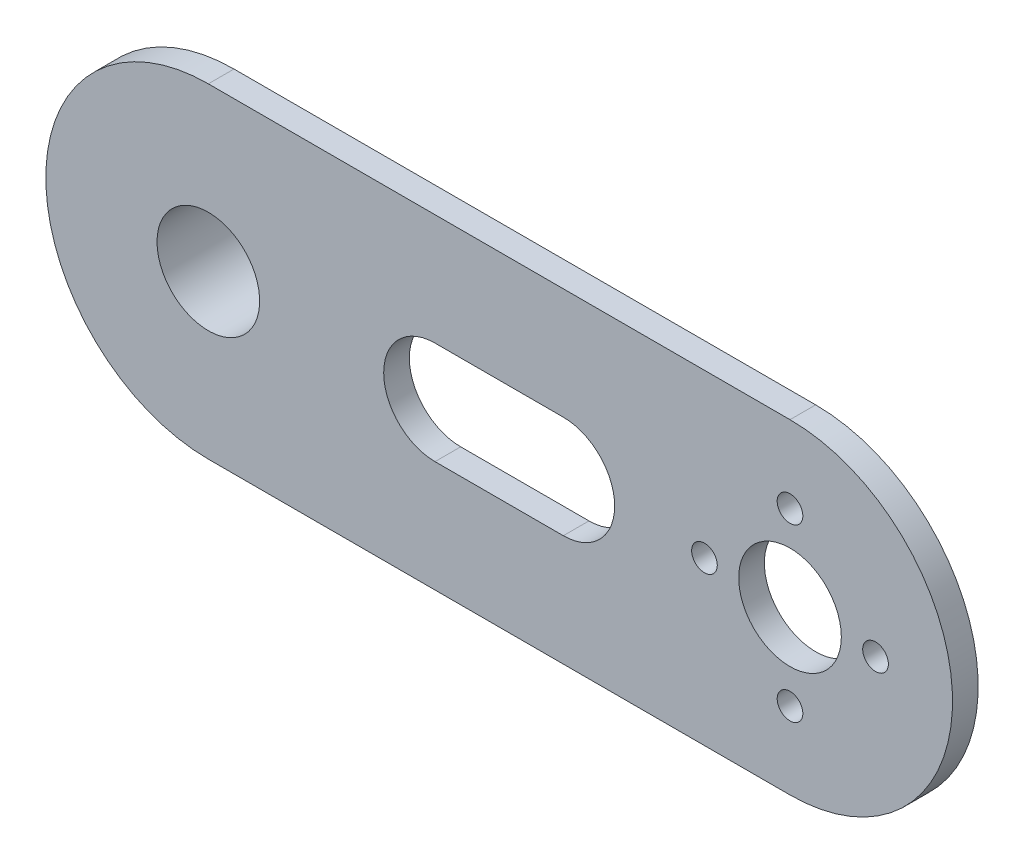
ISO-10303-21;
HEADER;
FILE_DESCRIPTION(('STEP AP214'),'2;1');
FILE_NAME('part.step','',(''),(''),'','','');
FILE_SCHEMA(('AUTOMOTIVE_DESIGN { 1 0 10303 214 1 1 1 1 }'));
ENDSEC;
DATA;
#1=APPLICATION_CONTEXT('core data for automotive mechanical design processes');
#2=APPLICATION_PROTOCOL_DEFINITION('international standard','automotive_design',2000,#1);
#3=PRODUCT_CONTEXT('',#1,'mechanical');
#4=PRODUCT('Part','Part','',(#3));
#5=PRODUCT_RELATED_PRODUCT_CATEGORY('part','',(#4));
#6=PRODUCT_DEFINITION_FORMATION('','',#4);
#7=PRODUCT_DEFINITION_CONTEXT('part definition',#1,'design');
#8=PRODUCT_DEFINITION('design','',#6,#7);
#9=PRODUCT_DEFINITION_SHAPE('','',#8);
#10=(LENGTH_UNIT() NAMED_UNIT(*) SI_UNIT(.MILLI.,.METRE.));
#11=(NAMED_UNIT(*) PLANE_ANGLE_UNIT() SI_UNIT($,.RADIAN.));
#12=(NAMED_UNIT(*) SI_UNIT($,.STERADIAN.) SOLID_ANGLE_UNIT());
#13=UNCERTAINTY_MEASURE_WITH_UNIT(LENGTH_MEASURE(1.E-05),#10,'distance_accuracy_value','');
#14=(GEOMETRIC_REPRESENTATION_CONTEXT(3) GLOBAL_UNCERTAINTY_ASSIGNED_CONTEXT((#13)) GLOBAL_UNIT_ASSIGNED_CONTEXT((#10,
#11,#12)) REPRESENTATION_CONTEXT('',''));
#15=CARTESIAN_POINT('',(0.,0.,0.));
#16=DIRECTION('',(0.,0.,1.));
#17=DIRECTION('',(1.,0.,0.));
#18=AXIS2_PLACEMENT_3D('',#15,#16,#17);
#19=CARTESIAN_POINT('',(0.,0.,9.));
#20=DIRECTION('',(0.,0.,-1.));
#21=DIRECTION('',(-1.,0.,0.));
#22=AXIS2_PLACEMENT_3D('',#19,#20,#21);
#23=CYLINDRICAL_SURFACE('',#22,19.);
#24=DIRECTION('',(0.,0.,1.));
#25=VECTOR('',#24,1.);
#26=CARTESIAN_POINT('',(0.,-19.,6.));
#27=LINE('',#26,#25);
#28=CARTESIAN_POINT('',(0.,-19.,6.));
#29=VERTEX_POINT('',#28);
#30=CARTESIAN_POINT('',(0.,-19.,9.));
#31=VERTEX_POINT('',#30);
#32=EDGE_CURVE('E202',#29,#31,#27,.T.);
#33=ORIENTED_EDGE('',*,*,#32,.T.);
#34=CARTESIAN_POINT('',(0.,0.,9.));
#35=DIRECTION('',(0.,0.,1.));
#36=DIRECTION('',(1.,0.,0.));
#37=AXIS2_PLACEMENT_3D('',#34,#35,#36);
#38=CIRCLE('',#37,19.);
#39=CARTESIAN_POINT('',(0.,19.,9.));
#40=VERTEX_POINT('',#39);
#41=EDGE_CURVE('E223',#40,#31,#38,.T.);
#42=ORIENTED_EDGE('',*,*,#41,.F.);
#43=DIRECTION('',(0.,0.,1.));
#44=VECTOR('',#43,1.);
#45=CARTESIAN_POINT('',(0.,19.,6.));
#46=LINE('',#45,#44);
#47=CARTESIAN_POINT('',(0.,19.,6.));
#48=VERTEX_POINT('',#47);
#49=EDGE_CURVE('E206',#48,#40,#46,.T.);
#50=ORIENTED_EDGE('',*,*,#49,.F.);
#51=CARTESIAN_POINT('',(0.,0.,6.));
#52=DIRECTION('',(0.,0.,1.));
#53=DIRECTION('',(1.,0.,0.));
#54=AXIS2_PLACEMENT_3D('',#51,#52,#53);
#55=CIRCLE('',#54,19.);
#56=EDGE_CURVE('E219',#48,#29,#55,.T.);
#57=ORIENTED_EDGE('',*,*,#56,.T.);
#58=EDGE_LOOP('',(#33,#42,#50,#57));
#59=FACE_BOUND('',#58,.T.);
#60=ADVANCED_FACE('F44',(#59),#23,.T.);
#61=CARTESIAN_POINT('',(0.,0.,4.));
#62=DIRECTION('',(0.,0.,-1.));
#63=DIRECTION('',(-1.,0.,0.));
#64=AXIS2_PLACEMENT_3D('',#61,#62,#63);
#65=CYLINDRICAL_SURFACE('',#64,9.985);
#66=CARTESIAN_POINT('',(0.,0.,4.));
#67=DIRECTION('',(0.,0.,1.));
#68=DIRECTION('',(1.,0.,0.));
#69=AXIS2_PLACEMENT_3D('',#66,#67,#68);
#70=CIRCLE('',#69,9.985);
#71=CARTESIAN_POINT('',(9.985,0.,4.));
#72=VERTEX_POINT('',#71);
#73=EDGE_CURVE('E238',#72,#72,#70,.T.);
#74=ORIENTED_EDGE('',*,*,#73,.F.);
#75=EDGE_LOOP('',(#74));
#76=FACE_BOUND('',#75,.T.);
#77=CARTESIAN_POINT('',(0.,0.,0.));
#78=DIRECTION('',(0.,0.,1.));
#79=DIRECTION('',(1.,0.,0.));
#80=AXIS2_PLACEMENT_3D('',#77,#78,#79);
#81=CIRCLE('',#80,9.985);
#82=CARTESIAN_POINT('',(9.985,0.,0.));
#83=VERTEX_POINT('',#82);
#84=EDGE_CURVE('E234',#83,#83,#81,.T.);
#85=ORIENTED_EDGE('',*,*,#84,.T.);
#86=EDGE_LOOP('',(#85));
#87=FACE_BOUND('',#86,.T.);
#88=ADVANCED_FACE('F46',(#76,#87),#65,.T.);
#89=CARTESIAN_POINT('',(0.,0.,0.));
#90=DIRECTION('',(0.,0.,1.));
#91=DIRECTION('',(1.,0.,0.));
#92=AXIS2_PLACEMENT_3D('',#89,#90,#91);
#93=PLANE('',#92);
#94=CARTESIAN_POINT('',(0.,0.,0.));
#95=DIRECTION('',(0.,0.,-1.));
#96=DIRECTION('',(-1.,0.,0.));
#97=AXIS2_PLACEMENT_3D('',#94,#95,#96);
#98=CIRCLE('',#97,6.);
#99=CARTESIAN_POINT('',(-6.,0.,0.));
#100=VERTEX_POINT('',#99);
#101=EDGE_CURVE('E205',#100,#100,#98,.T.);
#102=ORIENTED_EDGE('',*,*,#101,.F.);
#103=EDGE_LOOP('',(#102));
#104=FACE_BOUND('',#103,.T.);
#105=ORIENTED_EDGE('',*,*,#84,.F.);
#106=EDGE_LOOP('',(#105));
#107=FACE_BOUND('',#106,.T.);
#108=ADVANCED_FACE('F279',(#104,#107),#93,.F.);
#109=CARTESIAN_POINT('',(0.,0.,6.));
#110=DIRECTION('',(0.,0.,-1.));
#111=DIRECTION('',(-1.,0.,0.));
#112=AXIS2_PLACEMENT_3D('',#109,#110,#111);
#113=CYLINDRICAL_SURFACE('',#112,11.5);
#114=CARTESIAN_POINT('',(0.,0.,6.));
#115=DIRECTION('',(0.,0.,1.));
#116=DIRECTION('',(1.,0.,0.));
#117=AXIS2_PLACEMENT_3D('',#114,#115,#116);
#118=CIRCLE('',#117,11.5);
#119=CARTESIAN_POINT('',(11.5,0.,6.));
#120=VERTEX_POINT('',#119);
#121=EDGE_CURVE('E230',#120,#120,#118,.T.);
#122=ORIENTED_EDGE('',*,*,#121,.F.);
#123=EDGE_LOOP('',(#122));
#124=FACE_BOUND('',#123,.T.);
#125=CARTESIAN_POINT('',(0.,0.,4.));
#126=DIRECTION('',(0.,0.,1.));
#127=DIRECTION('',(1.,0.,0.));
#128=AXIS2_PLACEMENT_3D('',#125,#126,#127);
#129=CIRCLE('',#128,11.5);
#130=CARTESIAN_POINT('',(11.5,0.,4.));
#131=VERTEX_POINT('',#130);
#132=EDGE_CURVE('E227',#131,#131,#129,.T.);
#133=ORIENTED_EDGE('',*,*,#132,.T.);
#134=EDGE_LOOP('',(#133));
#135=FACE_BOUND('',#134,.T.);
#136=ADVANCED_FACE('F287',(#124,#135),#113,.T.);
#137=CARTESIAN_POINT('',(0.,0.,4.));
#138=DIRECTION('',(0.,0.,1.));
#139=DIRECTION('',(1.,0.,0.));
#140=AXIS2_PLACEMENT_3D('',#137,#138,#139);
#141=PLANE('',#140);
#142=ORIENTED_EDGE('',*,*,#73,.T.);
#143=EDGE_LOOP('',(#142));
#144=FACE_BOUND('',#143,.T.);
#145=ORIENTED_EDGE('',*,*,#132,.F.);
#146=EDGE_LOOP('',(#145));
#147=FACE_BOUND('',#146,.T.);
#148=ADVANCED_FACE('F284',(#144,#147),#141,.F.);
#149=CARTESIAN_POINT('',(0.,0.,9.));
#150=DIRECTION('',(0.,0.,1.));
#151=DIRECTION('',(1.,0.,0.));
#152=AXIS2_PLACEMENT_3D('',#149,#150,#151);
#153=PLANE('',#152);
#154=CARTESIAN_POINT('',(26.5,0.,9.));
#155=DIRECTION('',(0.,0.,1.));
#156=DIRECTION('',(1.,0.,0.));
#157=AXIS2_PLACEMENT_3D('',#154,#155,#156);
#158=CIRCLE('',#157,6.);
#159=CARTESIAN_POINT('',(26.5,6.,9.));
#160=VERTEX_POINT('',#159);
#161=CARTESIAN_POINT('',(26.5,-6.,9.));
#162=VERTEX_POINT('',#161);
#163=EDGE_CURVE('E60',#160,#162,#158,.T.);
#164=ORIENTED_EDGE('',*,*,#163,.F.);
#165=DIRECTION('',(-1.,0.,0.));
#166=VECTOR('',#165,1.);
#167=CARTESIAN_POINT('',(26.5,6.,9.));
#168=LINE('',#167,#166);
#169=CARTESIAN_POINT('',(41.5,6.,9.));
#170=VERTEX_POINT('',#169);
#171=EDGE_CURVE('E118',#170,#160,#168,.T.);
#172=ORIENTED_EDGE('',*,*,#171,.F.);
#173=CARTESIAN_POINT('',(41.5,0.,9.));
#174=DIRECTION('',(0.,0.,1.));
#175=DIRECTION('',(1.,0.,0.));
#176=AXIS2_PLACEMENT_3D('',#173,#174,#175);
#177=CIRCLE('',#176,6.);
#178=CARTESIAN_POINT('',(41.5,-6.,9.));
#179=VERTEX_POINT('',#178);
#180=EDGE_CURVE('E125',#179,#170,#177,.T.);
#181=ORIENTED_EDGE('',*,*,#180,.F.);
#182=DIRECTION('',(1.,0.,0.));
#183=VECTOR('',#182,1.);
#184=CARTESIAN_POINT('',(26.5,-6.,9.));
#185=LINE('',#184,#183);
#186=EDGE_CURVE('E131',#162,#179,#185,.T.);
#187=ORIENTED_EDGE('',*,*,#186,.F.);
#188=EDGE_LOOP('',(#164,#172,#181,#187));
#189=FACE_BOUND('',#188,.T.);
#190=CARTESIAN_POINT('',(0.,0.,9.));
#191=DIRECTION('',(0.,0.,-1.));
#192=DIRECTION('',(-1.,0.,0.));
#193=AXIS2_PLACEMENT_3D('',#190,#191,#192);
#194=CIRCLE('',#193,6.);
#195=CARTESIAN_POINT('',(-6.,0.,9.));
#196=VERTEX_POINT('',#195);
#197=EDGE_CURVE('E215',#196,#196,#194,.T.);
#198=ORIENTED_EDGE('',*,*,#197,.T.);
#199=EDGE_LOOP('',(#198));
#200=FACE_BOUND('',#199,.T.);
#201=ORIENTED_EDGE('',*,*,#41,.T.);
#202=DIRECTION('',(-1.,0.,0.));
#203=VECTOR('',#202,1.);
#204=CARTESIAN_POINT('',(0.,-19.,9.));
#205=LINE('',#204,#203);
#206=CARTESIAN_POINT('',(68.,-19.,9.));
#207=VERTEX_POINT('',#206);
#208=EDGE_CURVE('E133',#207,#31,#205,.T.);
#209=ORIENTED_EDGE('',*,*,#208,.F.);
#210=CARTESIAN_POINT('',(68.,0.,9.));
#211=DIRECTION('',(0.,0.,1.));
#212=DIRECTION('',(1.,0.,0.));
#213=AXIS2_PLACEMENT_3D('',#210,#211,#212);
#214=CIRCLE('',#213,19.);
#215=CARTESIAN_POINT('',(68.,19.,9.));
#216=VERTEX_POINT('',#215);
#217=EDGE_CURVE('E138',#207,#216,#214,.T.);
#218=ORIENTED_EDGE('',*,*,#217,.T.);
#219=DIRECTION('',(1.,0.,0.));
#220=VECTOR('',#219,1.);
#221=CARTESIAN_POINT('',(0.,19.,9.));
#222=LINE('',#221,#220);
#223=EDGE_CURVE('E179',#40,#216,#222,.T.);
#224=ORIENTED_EDGE('',*,*,#223,.F.);
#225=EDGE_LOOP('',(#201,#209,#218,#224));
#226=FACE_BOUND('',#225,.T.);
#227=CARTESIAN_POINT('',(58.,0.,9.));
#228=DIRECTION('',(0.,0.,1.));
#229=DIRECTION('',(1.,0.,0.));
#230=AXIS2_PLACEMENT_3D('',#227,#228,#229);
#231=CIRCLE('',#230,1.50000000000001);
#232=CARTESIAN_POINT('',(59.5,0.,9.));
#233=VERTEX_POINT('',#232);
#234=EDGE_CURVE('E183',#233,#233,#231,.T.);
#235=ORIENTED_EDGE('',*,*,#234,.F.);
#236=EDGE_LOOP('',(#235));
#237=FACE_BOUND('',#236,.T.);
#238=CARTESIAN_POINT('',(68.,-10.,9.));
#239=DIRECTION('',(0.,0.,1.));
#240=DIRECTION('',(1.,0.,0.));
#241=AXIS2_PLACEMENT_3D('',#238,#239,#240);
#242=CIRCLE('',#241,1.50000000000001);
#243=CARTESIAN_POINT('',(69.5,-10.,9.));
#244=VERTEX_POINT('',#243);
#245=EDGE_CURVE('E187',#244,#244,#242,.T.);
#246=ORIENTED_EDGE('',*,*,#245,.F.);
#247=EDGE_LOOP('',(#246));
#248=FACE_BOUND('',#247,.T.);
#249=CARTESIAN_POINT('',(78.,0.,9.));
#250=DIRECTION('',(0.,0.,1.));
#251=DIRECTION('',(1.,0.,0.));
#252=AXIS2_PLACEMENT_3D('',#249,#250,#251);
#253=CIRCLE('',#252,1.5);
#254=CARTESIAN_POINT('',(79.5,0.,9.));
#255=VERTEX_POINT('',#254);
#256=EDGE_CURVE('E191',#255,#255,#253,.T.);
#257=ORIENTED_EDGE('',*,*,#256,.F.);
#258=EDGE_LOOP('',(#257));
#259=FACE_BOUND('',#258,.T.);
#260=CARTESIAN_POINT('',(68.,10.,9.));
#261=DIRECTION('',(0.,0.,1.));
#262=DIRECTION('',(1.,0.,0.));
#263=AXIS2_PLACEMENT_3D('',#260,#261,#262);
#264=CIRCLE('',#263,1.5);
#265=CARTESIAN_POINT('',(69.5,10.,9.));
#266=VERTEX_POINT('',#265);
#267=EDGE_CURVE('E195',#266,#266,#264,.T.);
#268=ORIENTED_EDGE('',*,*,#267,.F.);
#269=EDGE_LOOP('',(#268));
#270=FACE_BOUND('',#269,.T.);
#271=CARTESIAN_POINT('',(68.,0.,9.));
#272=DIRECTION('',(0.,0.,1.));
#273=DIRECTION('',(1.,0.,0.));
#274=AXIS2_PLACEMENT_3D('',#271,#272,#273);
#275=CIRCLE('',#274,5.99999999999999);
#276=CARTESIAN_POINT('',(74.,0.,9.));
#277=VERTEX_POINT('',#276);
#278=EDGE_CURVE('E148',#277,#277,#275,.T.);
#279=ORIENTED_EDGE('',*,*,#278,.F.);
#280=EDGE_LOOP('',(#279));
#281=FACE_BOUND('',#280,.T.);
#282=ADVANCED_FACE('F129',(#189,#200,#226,#237,#248,#259,#270,#281),#153,.T.);
#283=CARTESIAN_POINT('',(0.,0.,6.));
#284=DIRECTION('',(0.,0.,1.));
#285=DIRECTION('',(1.,0.,0.));
#286=AXIS2_PLACEMENT_3D('',#283,#284,#285);
#287=PLANE('',#286);
#288=DIRECTION('',(-1.,0.,0.));
#289=VECTOR('',#288,1.);
#290=CARTESIAN_POINT('',(0.,5.99999999999999,6.));
#291=LINE('',#290,#289);
#292=CARTESIAN_POINT('',(41.5,6.,6.));
#293=VERTEX_POINT('',#292);
#294=CARTESIAN_POINT('',(26.5,6.,6.));
#295=VERTEX_POINT('',#294);
#296=EDGE_CURVE('E53',#293,#295,#291,.T.);
#297=ORIENTED_EDGE('',*,*,#296,.T.);
#298=CARTESIAN_POINT('',(26.5,0.,6.));
#299=DIRECTION('',(0.,0.,1.));
#300=DIRECTION('',(1.,0.,0.));
#301=AXIS2_PLACEMENT_3D('',#298,#299,#300);
#302=CIRCLE('',#301,6.);
#303=CARTESIAN_POINT('',(26.5,-6.,6.));
#304=VERTEX_POINT('',#303);
#305=EDGE_CURVE('E11',#295,#304,#302,.T.);
#306=ORIENTED_EDGE('',*,*,#305,.T.);
#307=DIRECTION('',(1.,0.,0.));
#308=VECTOR('',#307,1.);
#309=CARTESIAN_POINT('',(0.,-6.,6.));
#310=LINE('',#309,#308);
#311=CARTESIAN_POINT('',(41.5,-6.,6.));
#312=VERTEX_POINT('',#311);
#313=EDGE_CURVE('E242',#304,#312,#310,.T.);
#314=ORIENTED_EDGE('',*,*,#313,.T.);
#315=CARTESIAN_POINT('',(41.5,0.,6.));
#316=DIRECTION('',(0.,0.,1.));
#317=DIRECTION('',(1.,0.,0.));
#318=AXIS2_PLACEMENT_3D('',#315,#316,#317);
#319=CIRCLE('',#318,6.);
#320=EDGE_CURVE('E249',#312,#293,#319,.T.);
#321=ORIENTED_EDGE('',*,*,#320,.T.);
#322=EDGE_LOOP('',(#297,#306,#314,#321));
#323=FACE_BOUND('',#322,.T.);
#324=ORIENTED_EDGE('',*,*,#121,.T.);
#325=EDGE_LOOP('',(#324));
#326=FACE_BOUND('',#325,.T.);
#327=ORIENTED_EDGE('',*,*,#56,.F.);
#328=DIRECTION('',(1.,0.,0.));
#329=VECTOR('',#328,1.);
#330=CARTESIAN_POINT('',(0.,19.,6.));
#331=LINE('',#330,#329);
#332=CARTESIAN_POINT('',(68.,19.,6.));
#333=VERTEX_POINT('',#332);
#334=EDGE_CURVE('E152',#48,#333,#331,.T.);
#335=ORIENTED_EDGE('',*,*,#334,.T.);
#336=CARTESIAN_POINT('',(68.,0.,6.));
#337=DIRECTION('',(0.,0.,1.));
#338=DIRECTION('',(1.,0.,0.));
#339=AXIS2_PLACEMENT_3D('',#336,#337,#338);
#340=CIRCLE('',#339,19.);
#341=CARTESIAN_POINT('',(68.,-19.,6.));
#342=VERTEX_POINT('',#341);
#343=EDGE_CURVE('E147',#342,#333,#340,.T.);
#344=ORIENTED_EDGE('',*,*,#343,.F.);
#345=DIRECTION('',(-1.,0.,0.));
#346=VECTOR('',#345,1.);
#347=CARTESIAN_POINT('',(0.,-19.,6.));
#348=LINE('',#347,#346);
#349=EDGE_CURVE('E143',#342,#29,#348,.T.);
#350=ORIENTED_EDGE('',*,*,#349,.T.);
#351=EDGE_LOOP('',(#327,#335,#344,#350));
#352=FACE_BOUND('',#351,.T.);
#353=CARTESIAN_POINT('',(58.,0.,6.));
#354=DIRECTION('',(0.,0.,1.));
#355=DIRECTION('',(1.,0.,0.));
#356=AXIS2_PLACEMENT_3D('',#353,#354,#355);
#357=CIRCLE('',#356,1.50000000000001);
#358=CARTESIAN_POINT('',(59.5,0.,6.));
#359=VERTEX_POINT('',#358);
#360=EDGE_CURVE('E155',#359,#359,#357,.T.);
#361=ORIENTED_EDGE('',*,*,#360,.T.);
#362=EDGE_LOOP('',(#361));
#363=FACE_BOUND('',#362,.T.);
#364=CARTESIAN_POINT('',(68.,-10.,6.));
#365=DIRECTION('',(0.,0.,1.));
#366=DIRECTION('',(1.,0.,0.));
#367=AXIS2_PLACEMENT_3D('',#364,#365,#366);
#368=CIRCLE('',#367,1.50000000000001);
#369=CARTESIAN_POINT('',(69.5,-10.,6.));
#370=VERTEX_POINT('',#369);
#371=EDGE_CURVE('E159',#370,#370,#368,.T.);
#372=ORIENTED_EDGE('',*,*,#371,.T.);
#373=EDGE_LOOP('',(#372));
#374=FACE_BOUND('',#373,.T.);
#375=CARTESIAN_POINT('',(78.,0.,6.));
#376=DIRECTION('',(0.,0.,1.));
#377=DIRECTION('',(1.,0.,0.));
#378=AXIS2_PLACEMENT_3D('',#375,#376,#377);
#379=CIRCLE('',#378,1.5);
#380=CARTESIAN_POINT('',(79.5,0.,6.));
#381=VERTEX_POINT('',#380);
#382=EDGE_CURVE('E163',#381,#381,#379,.T.);
#383=ORIENTED_EDGE('',*,*,#382,.T.);
#384=EDGE_LOOP('',(#383));
#385=FACE_BOUND('',#384,.T.);
#386=CARTESIAN_POINT('',(68.,10.,6.));
#387=DIRECTION('',(0.,0.,1.));
#388=DIRECTION('',(1.,0.,0.));
#389=AXIS2_PLACEMENT_3D('',#386,#387,#388);
#390=CIRCLE('',#389,1.5);
#391=CARTESIAN_POINT('',(69.5,10.,6.));
#392=VERTEX_POINT('',#391);
#393=EDGE_CURVE('E167',#392,#392,#390,.T.);
#394=ORIENTED_EDGE('',*,*,#393,.T.);
#395=EDGE_LOOP('',(#394));
#396=FACE_BOUND('',#395,.T.);
#397=CARTESIAN_POINT('',(68.,0.,6.));
#398=DIRECTION('',(0.,0.,1.));
#399=DIRECTION('',(1.,0.,0.));
#400=AXIS2_PLACEMENT_3D('',#397,#398,#399);
#401=CIRCLE('',#400,5.99999999999999);
#402=CARTESIAN_POINT('',(74.,0.,6.));
#403=VERTEX_POINT('',#402);
#404=EDGE_CURVE('E171',#403,#403,#401,.T.);
#405=ORIENTED_EDGE('',*,*,#404,.T.);
#406=EDGE_LOOP('',(#405));
#407=FACE_BOUND('',#406,.T.);
#408=ADVANCED_FACE('F254',(#323,#326,#352,#363,#374,#385,#396,#407),#287,.F.);
#409=CARTESIAN_POINT('',(0.,0.,9.));
#410=DIRECTION('',(0.,0.,-1.));
#411=DIRECTION('',(-1.,0.,0.));
#412=AXIS2_PLACEMENT_3D('',#409,#410,#411);
#413=CYLINDRICAL_SURFACE('',#412,6.);
#414=ORIENTED_EDGE('',*,*,#197,.F.);
#415=EDGE_LOOP('',(#414));
#416=FACE_BOUND('',#415,.T.);
#417=ORIENTED_EDGE('',*,*,#101,.T.);
#418=EDGE_LOOP('',(#417));
#419=FACE_BOUND('',#418,.T.);
#420=ADVANCED_FACE('F300',(#416,#419),#413,.F.);
#421=CARTESIAN_POINT('',(0.,-19.,6.));
#422=DIRECTION('',(0.,1.,0.));
#423=DIRECTION('',(-1.,0.,0.));
#424=AXIS2_PLACEMENT_3D('',#421,#422,#423);
#425=PLANE('',#424);
#426=ORIENTED_EDGE('',*,*,#208,.T.);
#427=ORIENTED_EDGE('',*,*,#32,.F.);
#428=ORIENTED_EDGE('',*,*,#349,.F.);
#429=DIRECTION('',(0.,0.,1.));
#430=VECTOR('',#429,1.);
#431=CARTESIAN_POINT('',(68.,-19.,6.));
#432=LINE('',#431,#430);
#433=EDGE_CURVE('E174',#342,#207,#432,.T.);
#434=ORIENTED_EDGE('',*,*,#433,.T.);
#435=EDGE_LOOP('',(#426,#427,#428,#434));
#436=FACE_BOUND('',#435,.T.);
#437=ADVANCED_FACE('F302',(#436),#425,.F.);
#438=CARTESIAN_POINT('',(0.,19.,6.));
#439=DIRECTION('',(0.,-1.,0.));
#440=DIRECTION('',(1.,0.,0.));
#441=AXIS2_PLACEMENT_3D('',#438,#439,#440);
#442=PLANE('',#441);
#443=ORIENTED_EDGE('',*,*,#223,.T.);
#444=DIRECTION('',(0.,0.,1.));
#445=VECTOR('',#444,1.);
#446=CARTESIAN_POINT('',(68.,19.,6.));
#447=LINE('',#446,#445);
#448=EDGE_CURVE('E210',#333,#216,#447,.T.);
#449=ORIENTED_EDGE('',*,*,#448,.F.);
#450=ORIENTED_EDGE('',*,*,#334,.F.);
#451=ORIENTED_EDGE('',*,*,#49,.T.);
#452=EDGE_LOOP('',(#443,#449,#450,#451));
#453=FACE_BOUND('',#452,.T.);
#454=ADVANCED_FACE('F309',(#453),#442,.F.);
#455=CARTESIAN_POINT('',(68.,10.,6.));
#456=DIRECTION('',(0.,0.,1.));
#457=DIRECTION('',(1.,0.,0.));
#458=AXIS2_PLACEMENT_3D('',#455,#456,#457);
#459=CYLINDRICAL_SURFACE('',#458,1.5);
#460=ORIENTED_EDGE('',*,*,#393,.F.);
#461=EDGE_LOOP('',(#460));
#462=FACE_BOUND('',#461,.T.);
#463=ORIENTED_EDGE('',*,*,#267,.T.);
#464=EDGE_LOOP('',(#463));
#465=FACE_BOUND('',#464,.T.);
#466=ADVANCED_FACE('F402',(#462,#465),#459,.F.);
#467=CARTESIAN_POINT('',(78.,0.,6.));
#468=DIRECTION('',(0.,0.,1.));
#469=DIRECTION('',(1.,0.,0.));
#470=AXIS2_PLACEMENT_3D('',#467,#468,#469);
#471=CYLINDRICAL_SURFACE('',#470,1.5);
#472=ORIENTED_EDGE('',*,*,#382,.F.);
#473=EDGE_LOOP('',(#472));
#474=FACE_BOUND('',#473,.T.);
#475=ORIENTED_EDGE('',*,*,#256,.T.);
#476=EDGE_LOOP('',(#475));
#477=FACE_BOUND('',#476,.T.);
#478=ADVANCED_FACE('F392',(#474,#477),#471,.F.);
#479=CARTESIAN_POINT('',(68.,-10.,6.));
#480=DIRECTION('',(0.,0.,1.));
#481=DIRECTION('',(1.,0.,0.));
#482=AXIS2_PLACEMENT_3D('',#479,#480,#481);
#483=CYLINDRICAL_SURFACE('',#482,1.50000000000001);
#484=ORIENTED_EDGE('',*,*,#371,.F.);
#485=EDGE_LOOP('',(#484));
#486=FACE_BOUND('',#485,.T.);
#487=ORIENTED_EDGE('',*,*,#245,.T.);
#488=EDGE_LOOP('',(#487));
#489=FACE_BOUND('',#488,.T.);
#490=ADVANCED_FACE('F382',(#486,#489),#483,.F.);
#491=CARTESIAN_POINT('',(58.,0.,6.));
#492=DIRECTION('',(0.,0.,1.));
#493=DIRECTION('',(1.,0.,0.));
#494=AXIS2_PLACEMENT_3D('',#491,#492,#493);
#495=CYLINDRICAL_SURFACE('',#494,1.50000000000001);
#496=ORIENTED_EDGE('',*,*,#360,.F.);
#497=EDGE_LOOP('',(#496));
#498=FACE_BOUND('',#497,.T.);
#499=ORIENTED_EDGE('',*,*,#234,.T.);
#500=EDGE_LOOP('',(#499));
#501=FACE_BOUND('',#500,.T.);
#502=ADVANCED_FACE('F374',(#498,#501),#495,.F.);
#503=CARTESIAN_POINT('',(68.,0.,6.));
#504=DIRECTION('',(0.,0.,1.));
#505=DIRECTION('',(1.,0.,0.));
#506=AXIS2_PLACEMENT_3D('',#503,#504,#505);
#507=CYLINDRICAL_SURFACE('',#506,19.);
#508=ORIENTED_EDGE('',*,*,#217,.F.);
#509=ORIENTED_EDGE('',*,*,#433,.F.);
#510=ORIENTED_EDGE('',*,*,#343,.T.);
#511=ORIENTED_EDGE('',*,*,#448,.T.);
#512=EDGE_LOOP('',(#508,#509,#510,#511));
#513=FACE_BOUND('',#512,.T.);
#514=ADVANCED_FACE('F365',(#513),#507,.T.);
#515=CARTESIAN_POINT('',(68.,0.,6.));
#516=DIRECTION('',(0.,0.,1.));
#517=DIRECTION('',(1.,0.,0.));
#518=AXIS2_PLACEMENT_3D('',#515,#516,#517);
#519=CYLINDRICAL_SURFACE('',#518,5.99999999999999);
#520=ORIENTED_EDGE('',*,*,#404,.F.);
#521=EDGE_LOOP('',(#520));
#522=FACE_BOUND('',#521,.T.);
#523=ORIENTED_EDGE('',*,*,#278,.T.);
#524=EDGE_LOOP('',(#523));
#525=FACE_BOUND('',#524,.T.);
#526=ADVANCED_FACE('F321',(#522,#525),#519,.F.);
#527=CARTESIAN_POINT('',(26.5,0.,0.));
#528=DIRECTION('',(0.,0.,1.));
#529=DIRECTION('',(1.,0.,0.));
#530=AXIS2_PLACEMENT_3D('',#527,#528,#529);
#531=CYLINDRICAL_SURFACE('',#530,6.);
#532=DIRECTION('',(0.,0.,1.));
#533=VECTOR('',#532,1.);
#534=CARTESIAN_POINT('',(26.5,6.,0.));
#535=LINE('',#534,#533);
#536=EDGE_CURVE('E109',#295,#160,#535,.T.);
#537=ORIENTED_EDGE('',*,*,#536,.T.);
#538=ORIENTED_EDGE('',*,*,#163,.T.);
#539=DIRECTION('',(0.,0.,1.));
#540=VECTOR('',#539,1.);
#541=CARTESIAN_POINT('',(26.5,-6.,0.));
#542=LINE('',#541,#540);
#543=EDGE_CURVE('E126',#304,#162,#542,.T.);
#544=ORIENTED_EDGE('',*,*,#543,.F.);
#545=ORIENTED_EDGE('',*,*,#305,.F.);
#546=EDGE_LOOP('',(#537,#538,#544,#545));
#547=FACE_BOUND('',#546,.T.);
#548=ADVANCED_FACE('F111',(#547),#531,.F.);
#549=CARTESIAN_POINT('',(26.5,6.,0.));
#550=DIRECTION('',(0.,1.,0.));
#551=DIRECTION('',(-1.,0.,0.));
#552=AXIS2_PLACEMENT_3D('',#549,#550,#551);
#553=PLANE('',#552);
#554=DIRECTION('',(0.,0.,1.));
#555=VECTOR('',#554,1.);
#556=CARTESIAN_POINT('',(41.5,6.,0.));
#557=LINE('',#556,#555);
#558=EDGE_CURVE('E115',#293,#170,#557,.T.);
#559=ORIENTED_EDGE('',*,*,#558,.T.);
#560=ORIENTED_EDGE('',*,*,#171,.T.);
#561=ORIENTED_EDGE('',*,*,#536,.F.);
#562=ORIENTED_EDGE('',*,*,#296,.F.);
#563=EDGE_LOOP('',(#559,#560,#561,#562));
#564=FACE_BOUND('',#563,.T.);
#565=ADVANCED_FACE('F119',(#564),#553,.F.);
#566=CARTESIAN_POINT('',(41.5,0.,0.));
#567=DIRECTION('',(0.,0.,1.));
#568=DIRECTION('',(1.,0.,0.));
#569=AXIS2_PLACEMENT_3D('',#566,#567,#568);
#570=CYLINDRICAL_SURFACE('',#569,6.);
#571=DIRECTION('',(0.,0.,1.));
#572=VECTOR('',#571,1.);
#573=CARTESIAN_POINT('',(41.5,-6.,0.));
#574=LINE('',#573,#572);
#575=EDGE_CURVE('E68',#312,#179,#574,.T.);
#576=ORIENTED_EDGE('',*,*,#575,.T.);
#577=ORIENTED_EDGE('',*,*,#180,.T.);
#578=ORIENTED_EDGE('',*,*,#558,.F.);
#579=ORIENTED_EDGE('',*,*,#320,.F.);
#580=EDGE_LOOP('',(#576,#577,#578,#579));
#581=FACE_BOUND('',#580,.T.);
#582=ADVANCED_FACE('F257',(#581),#570,.F.);
#583=CARTESIAN_POINT('',(26.5,-6.,0.));
#584=DIRECTION('',(0.,-1.,0.));
#585=DIRECTION('',(1.,0.,0.));
#586=AXIS2_PLACEMENT_3D('',#583,#584,#585);
#587=PLANE('',#586);
#588=ORIENTED_EDGE('',*,*,#543,.T.);
#589=ORIENTED_EDGE('',*,*,#186,.T.);
#590=ORIENTED_EDGE('',*,*,#575,.F.);
#591=ORIENTED_EDGE('',*,*,#313,.F.);
#592=EDGE_LOOP('',(#588,#589,#590,#591));
#593=FACE_BOUND('',#592,.T.);
#594=ADVANCED_FACE('F265',(#593),#587,.F.);
#595=CLOSED_SHELL('',(#60,#88,#108,#136,#148,#282,#408,#420,#437,#454,#466,#478,#490,#502,#514,
#526,#548,#565,#582,#594));
#596=MANIFOLD_SOLID_BREP('B2',#595);
#597=ADVANCED_BREP_SHAPE_REPRESENTATION('',(#18,#596),#14);
#598=SHAPE_DEFINITION_REPRESENTATION(#9,#597);
ENDSEC;
END-ISO-10303-21;
